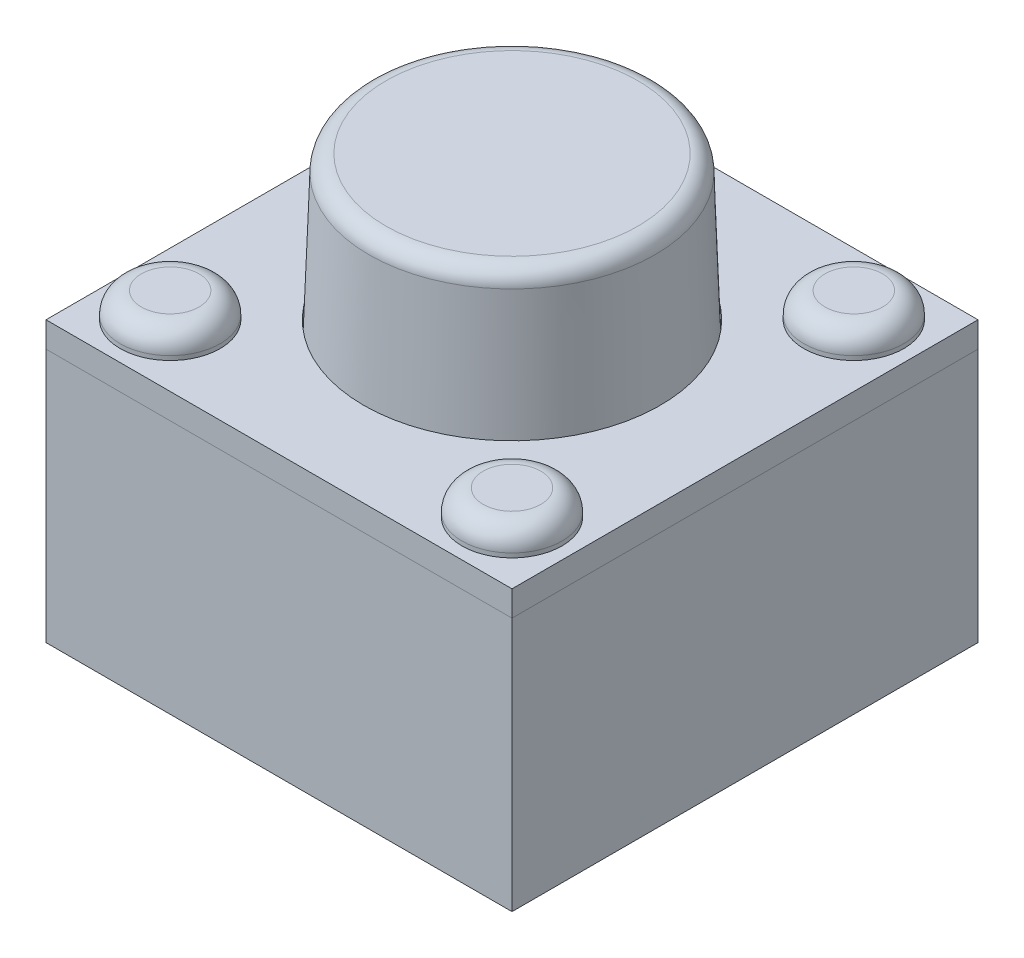
ISO-10303-21;
HEADER;
FILE_DESCRIPTION(('STEP AP214'),'2;1');
FILE_NAME('part.step','',(''),(''),'','','');
FILE_SCHEMA(('AUTOMOTIVE_DESIGN { 1 0 10303 214 1 1 1 1 }'));
ENDSEC;
DATA;
#1=APPLICATION_CONTEXT('core data for automotive mechanical design processes');
#2=APPLICATION_PROTOCOL_DEFINITION('international standard','automotive_design',2000,#1);
#3=PRODUCT_CONTEXT('',#1,'mechanical');
#4=PRODUCT('Part','Part','',(#3));
#5=PRODUCT_RELATED_PRODUCT_CATEGORY('part','',(#4));
#6=PRODUCT_DEFINITION_FORMATION('','',#4);
#7=PRODUCT_DEFINITION_CONTEXT('part definition',#1,'design');
#8=PRODUCT_DEFINITION('design','',#6,#7);
#9=PRODUCT_DEFINITION_SHAPE('','',#8);
#10=(LENGTH_UNIT() NAMED_UNIT(*) SI_UNIT(.MILLI.,.METRE.));
#11=(NAMED_UNIT(*) PLANE_ANGLE_UNIT() SI_UNIT($,.RADIAN.));
#12=(NAMED_UNIT(*) SI_UNIT($,.STERADIAN.) SOLID_ANGLE_UNIT());
#13=UNCERTAINTY_MEASURE_WITH_UNIT(LENGTH_MEASURE(1.E-05),#10,'distance_accuracy_value','');
#14=(GEOMETRIC_REPRESENTATION_CONTEXT(3) GLOBAL_UNCERTAINTY_ASSIGNED_CONTEXT((#13)) GLOBAL_UNIT_ASSIGNED_CONTEXT((#10,
#11,#12)) REPRESENTATION_CONTEXT('',''));
#15=CARTESIAN_POINT('',(0.,0.,0.));
#16=DIRECTION('',(0.,0.,1.));
#17=DIRECTION('',(1.,0.,0.));
#18=AXIS2_PLACEMENT_3D('',#15,#16,#17);
#19=CARTESIAN_POINT('',(0.,3.,0.));
#20=DIRECTION('',(0.,-1.,0.));
#21=DIRECTION('',(0.,0.,1.));
#22=AXIS2_PLACEMENT_3D('',#19,#20,#21);
#23=CONICAL_SURFACE('',#22,1.75,0.0349065850398867);
#24=CARTESIAN_POINT('',(0.,4.8069798993405,0.));
#25=DIRECTION('',(0.,-1.,0.));
#26=DIRECTION('',(0.,0.,-1.));
#27=AXIS2_PLACEMENT_3D('',#24,#25,#26);
#28=CIRCLE('',#27,1.68689887145891);
#29=CARTESIAN_POINT('',(0.,4.8069798993405,-1.68689887145891));
#30=VERTEX_POINT('',#29);
#31=EDGE_CURVE('E11',#30,#30,#28,.T.);
#32=ORIENTED_EDGE('',*,*,#31,.T.);
#33=EDGE_LOOP('',(#32));
#34=FACE_BOUND('',#33,.T.);
#35=CARTESIAN_POINT('',(0.,3.,0.));
#36=DIRECTION('',(0.,1.,0.));
#37=DIRECTION('',(0.,0.,1.));
#38=AXIS2_PLACEMENT_3D('',#35,#36,#37);
#39=CIRCLE('',#38,1.75);
#40=CARTESIAN_POINT('',(0.,3.,1.75));
#41=VERTEX_POINT('',#40);
#42=EDGE_CURVE('E54',#41,#41,#39,.T.);
#43=ORIENTED_EDGE('',*,*,#42,.T.);
#44=EDGE_LOOP('',(#43));
#45=FACE_BOUND('',#44,.T.);
#46=ADVANCED_FACE('F43',(#34,#45),#23,.T.);
#47=CARTESIAN_POINT('',(0.,5.,0.));
#48=DIRECTION('',(0.,1.,0.));
#49=DIRECTION('',(0.,0.,1.));
#50=AXIS2_PLACEMENT_3D('',#47,#48,#49);
#51=PLANE('',#50);
#52=CARTESIAN_POINT('',(0.,5.,0.));
#53=DIRECTION('',(0.,1.,0.));
#54=DIRECTION('',(0.,0.,1.));
#55=AXIS2_PLACEMENT_3D('',#52,#53,#54);
#56=CIRCLE('',#55,1.48702070605509);
#57=CARTESIAN_POINT('',(0.,5.,1.48702070605509));
#58=VERTEX_POINT('',#57);
#59=EDGE_CURVE('E50',#58,#58,#56,.T.);
#60=ORIENTED_EDGE('',*,*,#59,.T.);
#61=EDGE_LOOP('',(#60));
#62=FACE_BOUND('',#61,.T.);
#63=ADVANCED_FACE('F64',(#62),#51,.T.);
#64=CARTESIAN_POINT('',(0.,3.,0.));
#65=DIRECTION('',(0.,1.,0.));
#66=DIRECTION('',(0.,0.,1.));
#67=AXIS2_PLACEMENT_3D('',#64,#65,#66);
#68=PLANE('',#67);
#69=ORIENTED_EDGE('',*,*,#42,.F.);
#70=EDGE_LOOP('',(#69));
#71=FACE_BOUND('',#70,.T.);
#72=ADVANCED_FACE('F62',(#71),#68,.F.);
#73=CARTESIAN_POINT('',(0.,4.8,0.));
#74=DIRECTION('',(0.,1.,0.));
#75=DIRECTION('',(0.,0.,1.));
#76=AXIS2_PLACEMENT_3D('',#73,#74,#75);
#77=TOROIDAL_SURFACE('',#76,1.48702070605509,0.2);
#78=ORIENTED_EDGE('',*,*,#31,.F.);
#79=EDGE_LOOP('',(#78));
#80=FACE_BOUND('',#79,.T.);
#81=ORIENTED_EDGE('',*,*,#59,.F.);
#82=EDGE_LOOP('',(#81));
#83=FACE_BOUND('',#82,.T.);
#84=ADVANCED_FACE('F45',(#80,#83),#77,.T.);
#85=CLOSED_SHELL('',(#46,#63,#72,#84));
#86=MANIFOLD_SOLID_BREP('B2',#85);
#87=CARTESIAN_POINT('',(0.,3.3,0.));
#88=DIRECTION('',(0.,1.,0.));
#89=DIRECTION('',(0.,0.,1.));
#90=AXIS2_PLACEMENT_3D('',#87,#88,#89);
#91=PLANE('',#90);
#92=CARTESIAN_POINT('',(2.01719027237659,3.3,2.01719027237636));
#93=DIRECTION('',(0.,1.,0.));
#94=DIRECTION('',(0.,0.,1.));
#95=AXIS2_PLACEMENT_3D('',#92,#93,#94);
#96=CIRCLE('',#95,0.59000000000016);
#97=CARTESIAN_POINT('',(2.01719027237659,3.3,2.60719027237652));
#98=VERTEX_POINT('',#97);
#99=EDGE_CURVE('E201',#98,#98,#96,.T.);
#100=ORIENTED_EDGE('',*,*,#99,.F.);
#101=EDGE_LOOP('',(#100));
#102=FACE_BOUND('',#101,.T.);
#103=CARTESIAN_POINT('',(-2.01719027237647,3.3,-2.01719027237647));
#104=DIRECTION('',(0.,1.,0.));
#105=DIRECTION('',(0.,0.,1.));
#106=AXIS2_PLACEMENT_3D('',#103,#104,#105);
#107=CIRCLE('',#106,0.59);
#108=CARTESIAN_POINT('',(-2.01719027237647,3.3,-1.42719027237647));
#109=VERTEX_POINT('',#108);
#110=EDGE_CURVE('E189',#109,#109,#107,.T.);
#111=ORIENTED_EDGE('',*,*,#110,.F.);
#112=EDGE_LOOP('',(#111));
#113=FACE_BOUND('',#112,.T.);
#114=DIRECTION('',(-1.,0.,0.));
#115=VECTOR('',#114,1.);
#116=CARTESIAN_POINT('',(2.75,3.3,-2.75));
#117=LINE('',#116,#115);
#118=CARTESIAN_POINT('',(2.75,3.3,-2.75));
#119=VERTEX_POINT('',#118);
#120=CARTESIAN_POINT('',(-2.75,3.3,-2.75));
#121=VERTEX_POINT('',#120);
#122=EDGE_CURVE('E159',#119,#121,#117,.T.);
#123=ORIENTED_EDGE('',*,*,#122,.T.);
#124=DIRECTION('',(0.,0.,1.));
#125=VECTOR('',#124,1.);
#126=CARTESIAN_POINT('',(-2.75,3.3,-2.75));
#127=LINE('',#126,#125);
#128=CARTESIAN_POINT('',(-2.75,3.3,2.75));
#129=VERTEX_POINT('',#128);
#130=EDGE_CURVE('E154',#121,#129,#127,.T.);
#131=ORIENTED_EDGE('',*,*,#130,.T.);
#132=DIRECTION('',(1.,0.,0.));
#133=VECTOR('',#132,1.);
#134=CARTESIAN_POINT('',(-2.75,3.3,2.75));
#135=LINE('',#134,#133);
#136=CARTESIAN_POINT('',(2.75,3.3,2.75));
#137=VERTEX_POINT('',#136);
#138=EDGE_CURVE('E157',#129,#137,#135,.T.);
#139=ORIENTED_EDGE('',*,*,#138,.T.);
#140=DIRECTION('',(0.,0.,-1.));
#141=VECTOR('',#140,1.);
#142=CARTESIAN_POINT('',(2.75,3.3,2.75));
#143=LINE('',#142,#141);
#144=EDGE_CURVE('E124',#137,#119,#143,.T.);
#145=ORIENTED_EDGE('',*,*,#144,.T.);
#146=EDGE_LOOP('',(#123,#131,#139,#145));
#147=FACE_BOUND('',#146,.T.);
#148=CARTESIAN_POINT('',(0.,3.3,0.));
#149=DIRECTION('',(0.,1.,0.));
#150=DIRECTION('',(0.,0.,1.));
#151=AXIS2_PLACEMENT_3D('',#148,#149,#150);
#152=CIRCLE('',#151,1.75);
#153=CARTESIAN_POINT('',(0.,3.3,1.75));
#154=VERTEX_POINT('',#153);
#155=EDGE_CURVE('E174',#154,#154,#152,.T.);
#156=ORIENTED_EDGE('',*,*,#155,.F.);
#157=EDGE_LOOP('',(#156));
#158=FACE_BOUND('',#157,.T.);
#159=CARTESIAN_POINT('',(2.01719027237647,3.3,-2.01719027237659));
#160=DIRECTION('',(0.,1.,0.));
#161=DIRECTION('',(0.,0.,1.));
#162=AXIS2_PLACEMENT_3D('',#159,#160,#161);
#163=CIRCLE('',#162,0.590000000000117);
#164=CARTESIAN_POINT('',(2.01719027237647,3.3,-1.42719027237647));
#165=VERTEX_POINT('',#164);
#166=EDGE_CURVE('E195',#165,#165,#163,.T.);
#167=ORIENTED_EDGE('',*,*,#166,.F.);
#168=EDGE_LOOP('',(#167));
#169=FACE_BOUND('',#168,.T.);
#170=CARTESIAN_POINT('',(-2.01719027237636,3.3,2.01719027237647));
#171=DIRECTION('',(0.,1.,0.));
#172=DIRECTION('',(0.,0.,1.));
#173=AXIS2_PLACEMENT_3D('',#170,#171,#172);
#174=CIRCLE('',#173,0.590000000000059);
#175=CARTESIAN_POINT('',(-2.01719027237636,3.3,2.60719027237653));
#176=VERTEX_POINT('',#175);
#177=EDGE_CURVE('E207',#176,#176,#174,.T.);
#178=ORIENTED_EDGE('',*,*,#177,.F.);
#179=EDGE_LOOP('',(#178));
#180=FACE_BOUND('',#179,.T.);
#181=ADVANCED_FACE('F107',(#102,#113,#147,#158,#169,#180),#91,.T.);
#182=CARTESIAN_POINT('',(0.,3.,0.));
#183=DIRECTION('',(0.,1.,0.));
#184=DIRECTION('',(0.,0.,1.));
#185=AXIS2_PLACEMENT_3D('',#182,#183,#184);
#186=PLANE('',#185);
#187=CARTESIAN_POINT('',(2.01719027237659,3.,2.01719027237636));
#188=DIRECTION('',(0.,1.,0.));
#189=DIRECTION('',(0.,0.,1.));
#190=AXIS2_PLACEMENT_3D('',#187,#188,#189);
#191=CIRCLE('',#190,0.59000000000016);
#192=CARTESIAN_POINT('',(2.01719027237659,3.,2.60719027237652));
#193=VERTEX_POINT('',#192);
#194=EDGE_CURVE('E204',#193,#193,#191,.T.);
#195=ORIENTED_EDGE('',*,*,#194,.T.);
#196=EDGE_LOOP('',(#195));
#197=FACE_BOUND('',#196,.T.);
#198=CARTESIAN_POINT('',(-2.01719027237647,3.,-2.01719027237647));
#199=DIRECTION('',(0.,1.,0.));
#200=DIRECTION('',(0.,0.,1.));
#201=AXIS2_PLACEMENT_3D('',#198,#199,#200);
#202=CIRCLE('',#201,0.59);
#203=CARTESIAN_POINT('',(-2.01719027237647,3.,-1.42719027237647));
#204=VERTEX_POINT('',#203);
#205=EDGE_CURVE('E192',#204,#204,#202,.T.);
#206=ORIENTED_EDGE('',*,*,#205,.T.);
#207=EDGE_LOOP('',(#206));
#208=FACE_BOUND('',#207,.T.);
#209=DIRECTION('',(-1.,0.,0.));
#210=VECTOR('',#209,1.);
#211=CARTESIAN_POINT('',(2.75,3.,-2.75));
#212=LINE('',#211,#210);
#213=CARTESIAN_POINT('',(2.75,3.,-2.75));
#214=VERTEX_POINT('',#213);
#215=CARTESIAN_POINT('',(-2.75,3.,-2.75));
#216=VERTEX_POINT('',#215);
#217=EDGE_CURVE('E171',#214,#216,#212,.T.);
#218=ORIENTED_EDGE('',*,*,#217,.F.);
#219=DIRECTION('',(0.,0.,-1.));
#220=VECTOR('',#219,1.);
#221=CARTESIAN_POINT('',(2.75,3.,2.75));
#222=LINE('',#221,#220);
#223=CARTESIAN_POINT('',(2.75,3.,2.75));
#224=VERTEX_POINT('',#223);
#225=EDGE_CURVE('E147',#224,#214,#222,.T.);
#226=ORIENTED_EDGE('',*,*,#225,.F.);
#227=DIRECTION('',(1.,0.,0.));
#228=VECTOR('',#227,1.);
#229=CARTESIAN_POINT('',(-2.75,3.,2.75));
#230=LINE('',#229,#228);
#231=CARTESIAN_POINT('',(-2.75,3.,2.75));
#232=VERTEX_POINT('',#231);
#233=EDGE_CURVE('E141',#232,#224,#230,.T.);
#234=ORIENTED_EDGE('',*,*,#233,.F.);
#235=DIRECTION('',(0.,0.,1.));
#236=VECTOR('',#235,1.);
#237=CARTESIAN_POINT('',(-2.75,3.,-2.75));
#238=LINE('',#237,#236);
#239=EDGE_CURVE('E163',#216,#232,#238,.T.);
#240=ORIENTED_EDGE('',*,*,#239,.F.);
#241=EDGE_LOOP('',(#218,#226,#234,#240));
#242=FACE_BOUND('',#241,.T.);
#243=CARTESIAN_POINT('',(0.,3.,0.));
#244=DIRECTION('',(0.,1.,0.));
#245=DIRECTION('',(0.,0.,1.));
#246=AXIS2_PLACEMENT_3D('',#243,#244,#245);
#247=CIRCLE('',#246,1.75);
#248=CARTESIAN_POINT('',(0.,3.,1.75));
#249=VERTEX_POINT('',#248);
#250=EDGE_CURVE('E186',#249,#249,#247,.T.);
#251=ORIENTED_EDGE('',*,*,#250,.T.);
#252=EDGE_LOOP('',(#251));
#253=FACE_BOUND('',#252,.T.);
#254=CARTESIAN_POINT('',(2.01719027237647,3.,-2.01719027237659));
#255=DIRECTION('',(0.,1.,0.));
#256=DIRECTION('',(0.,0.,1.));
#257=AXIS2_PLACEMENT_3D('',#254,#255,#256);
#258=CIRCLE('',#257,0.590000000000117);
#259=CARTESIAN_POINT('',(2.01719027237647,3.,-1.42719027237647));
#260=VERTEX_POINT('',#259);
#261=EDGE_CURVE('E198',#260,#260,#258,.T.);
#262=ORIENTED_EDGE('',*,*,#261,.T.);
#263=EDGE_LOOP('',(#262));
#264=FACE_BOUND('',#263,.T.);
#265=CARTESIAN_POINT('',(-2.01719027237636,3.,2.01719027237647));
#266=DIRECTION('',(0.,1.,0.));
#267=DIRECTION('',(0.,0.,1.));
#268=AXIS2_PLACEMENT_3D('',#265,#266,#267);
#269=CIRCLE('',#268,0.590000000000059);
#270=CARTESIAN_POINT('',(-2.01719027237636,3.,2.60719027237653));
#271=VERTEX_POINT('',#270);
#272=EDGE_CURVE('E210',#271,#271,#269,.T.);
#273=ORIENTED_EDGE('',*,*,#272,.T.);
#274=EDGE_LOOP('',(#273));
#275=FACE_BOUND('',#274,.T.);
#276=ADVANCED_FACE('F182',(#197,#208,#242,#253,#264,#275),#186,.F.);
#277=CARTESIAN_POINT('',(2.75,3.3,-2.75));
#278=DIRECTION('',(0.,0.,1.));
#279=DIRECTION('',(1.,0.,0.));
#280=AXIS2_PLACEMENT_3D('',#277,#278,#279);
#281=PLANE('',#280);
#282=ORIENTED_EDGE('',*,*,#217,.T.);
#283=DIRECTION('',(0.,-1.,0.));
#284=VECTOR('',#283,1.);
#285=CARTESIAN_POINT('',(-2.75,3.3,-2.75));
#286=LINE('',#285,#284);
#287=EDGE_CURVE('E41',#121,#216,#286,.T.);
#288=ORIENTED_EDGE('',*,*,#287,.F.);
#289=ORIENTED_EDGE('',*,*,#122,.F.);
#290=DIRECTION('',(0.,-1.,0.));
#291=VECTOR('',#290,1.);
#292=CARTESIAN_POINT('',(2.75,3.3,-2.75));
#293=LINE('',#292,#291);
#294=EDGE_CURVE('E167',#119,#214,#293,.T.);
#295=ORIENTED_EDGE('',*,*,#294,.T.);
#296=EDGE_LOOP('',(#282,#288,#289,#295));
#297=FACE_BOUND('',#296,.T.);
#298=ADVANCED_FACE('F109',(#297),#281,.F.);
#299=CARTESIAN_POINT('',(-2.75,3.3,-2.75));
#300=DIRECTION('',(1.,0.,0.));
#301=DIRECTION('',(0.,0.,-1.));
#302=AXIS2_PLACEMENT_3D('',#299,#300,#301);
#303=PLANE('',#302);
#304=ORIENTED_EDGE('',*,*,#239,.T.);
#305=DIRECTION('',(0.,-1.,0.));
#306=VECTOR('',#305,1.);
#307=CARTESIAN_POINT('',(-2.75,3.3,2.75));
#308=LINE('',#307,#306);
#309=EDGE_CURVE('E116',#129,#232,#308,.T.);
#310=ORIENTED_EDGE('',*,*,#309,.F.);
#311=ORIENTED_EDGE('',*,*,#130,.F.);
#312=ORIENTED_EDGE('',*,*,#287,.T.);
#313=EDGE_LOOP('',(#304,#310,#311,#312));
#314=FACE_BOUND('',#313,.T.);
#315=ADVANCED_FACE('F162',(#314),#303,.F.);
#316=CARTESIAN_POINT('',(-2.75,3.3,2.75));
#317=DIRECTION('',(0.,0.,-1.));
#318=DIRECTION('',(-1.,0.,0.));
#319=AXIS2_PLACEMENT_3D('',#316,#317,#318);
#320=PLANE('',#319);
#321=ORIENTED_EDGE('',*,*,#233,.T.);
#322=DIRECTION('',(0.,-1.,0.));
#323=VECTOR('',#322,1.);
#324=CARTESIAN_POINT('',(2.75,3.3,2.75));
#325=LINE('',#324,#323);
#326=EDGE_CURVE('E164',#137,#224,#325,.T.);
#327=ORIENTED_EDGE('',*,*,#326,.F.);
#328=ORIENTED_EDGE('',*,*,#138,.F.);
#329=ORIENTED_EDGE('',*,*,#309,.T.);
#330=EDGE_LOOP('',(#321,#327,#328,#329));
#331=FACE_BOUND('',#330,.T.);
#332=ADVANCED_FACE('F165',(#331),#320,.F.);
#333=CARTESIAN_POINT('',(2.75,3.3,2.75));
#334=DIRECTION('',(-1.,0.,0.));
#335=DIRECTION('',(0.,0.,1.));
#336=AXIS2_PLACEMENT_3D('',#333,#334,#335);
#337=PLANE('',#336);
#338=ORIENTED_EDGE('',*,*,#225,.T.);
#339=ORIENTED_EDGE('',*,*,#294,.F.);
#340=ORIENTED_EDGE('',*,*,#144,.F.);
#341=ORIENTED_EDGE('',*,*,#326,.T.);
#342=EDGE_LOOP('',(#338,#339,#340,#341));
#343=FACE_BOUND('',#342,.T.);
#344=ADVANCED_FACE('F179',(#343),#337,.F.);
#345=CARTESIAN_POINT('',(0.,3.3,0.));
#346=DIRECTION('',(0.,-1.,0.));
#347=DIRECTION('',(0.,0.,-1.));
#348=AXIS2_PLACEMENT_3D('',#345,#346,#347);
#349=CYLINDRICAL_SURFACE('',#348,1.75);
#350=ORIENTED_EDGE('',*,*,#155,.T.);
#351=EDGE_LOOP('',(#350));
#352=FACE_BOUND('',#351,.T.);
#353=ORIENTED_EDGE('',*,*,#250,.F.);
#354=EDGE_LOOP('',(#353));
#355=FACE_BOUND('',#354,.T.);
#356=ADVANCED_FACE('F230',(#352,#355),#349,.F.);
#357=CARTESIAN_POINT('',(-2.01719027237647,3.3,-2.01719027237647));
#358=DIRECTION('',(0.,-1.,0.));
#359=DIRECTION('',(0.,0.,-1.));
#360=AXIS2_PLACEMENT_3D('',#357,#358,#359);
#361=CYLINDRICAL_SURFACE('',#360,0.59);
#362=ORIENTED_EDGE('',*,*,#110,.T.);
#363=EDGE_LOOP('',(#362));
#364=FACE_BOUND('',#363,.T.);
#365=ORIENTED_EDGE('',*,*,#205,.F.);
#366=EDGE_LOOP('',(#365));
#367=FACE_BOUND('',#366,.T.);
#368=ADVANCED_FACE('F276',(#364,#367),#361,.F.);
#369=CARTESIAN_POINT('',(2.01719027237647,3.3,-2.01719027237659));
#370=DIRECTION('',(0.,-1.,0.));
#371=DIRECTION('',(0.,0.,-1.));
#372=AXIS2_PLACEMENT_3D('',#369,#370,#371);
#373=CYLINDRICAL_SURFACE('',#372,0.590000000000117);
#374=ORIENTED_EDGE('',*,*,#166,.T.);
#375=EDGE_LOOP('',(#374));
#376=FACE_BOUND('',#375,.T.);
#377=ORIENTED_EDGE('',*,*,#261,.F.);
#378=EDGE_LOOP('',(#377));
#379=FACE_BOUND('',#378,.T.);
#380=ADVANCED_FACE('F284',(#376,#379),#373,.F.);
#381=CARTESIAN_POINT('',(2.01719027237659,3.3,2.01719027237636));
#382=DIRECTION('',(0.,-1.,0.));
#383=DIRECTION('',(0.,0.,-1.));
#384=AXIS2_PLACEMENT_3D('',#381,#382,#383);
#385=CYLINDRICAL_SURFACE('',#384,0.59000000000016);
#386=ORIENTED_EDGE('',*,*,#99,.T.);
#387=EDGE_LOOP('',(#386));
#388=FACE_BOUND('',#387,.T.);
#389=ORIENTED_EDGE('',*,*,#194,.F.);
#390=EDGE_LOOP('',(#389));
#391=FACE_BOUND('',#390,.T.);
#392=ADVANCED_FACE('F292',(#388,#391),#385,.F.);
#393=CARTESIAN_POINT('',(-2.01719027237636,3.3,2.01719027237647));
#394=DIRECTION('',(0.,-1.,0.));
#395=DIRECTION('',(0.,0.,-1.));
#396=AXIS2_PLACEMENT_3D('',#393,#394,#395);
#397=CYLINDRICAL_SURFACE('',#396,0.590000000000059);
#398=ORIENTED_EDGE('',*,*,#177,.T.);
#399=EDGE_LOOP('',(#398));
#400=FACE_BOUND('',#399,.T.);
#401=ORIENTED_EDGE('',*,*,#272,.F.);
#402=EDGE_LOOP('',(#401));
#403=FACE_BOUND('',#402,.T.);
#404=ADVANCED_FACE('F216',(#400,#403),#397,.F.);
#405=CLOSED_SHELL('',(#181,#276,#298,#315,#332,#344,#356,#368,#380,#392,#404));
#406=MANIFOLD_SOLID_BREP('B6',#405);
#407=CARTESIAN_POINT('',(0.,3.,0.));
#408=DIRECTION('',(0.,1.,0.));
#409=DIRECTION('',(0.,0.,1.));
#410=AXIS2_PLACEMENT_3D('',#407,#408,#409);
#411=PLANE('',#410);
#412=CARTESIAN_POINT('',(2.01719027237659,3.,2.01719027237636));
#413=DIRECTION('',(0.,1.,0.));
#414=DIRECTION('',(0.,0.,1.));
#415=AXIS2_PLACEMENT_3D('',#412,#413,#414);
#416=CIRCLE('',#415,0.59000000000016);
#417=CARTESIAN_POINT('',(2.01719027237659,3.,2.60719027237652));
#418=VERTEX_POINT('',#417);
#419=EDGE_CURVE('E518',#418,#418,#416,.T.);
#420=ORIENTED_EDGE('',*,*,#419,.F.);
#421=EDGE_LOOP('',(#420));
#422=FACE_BOUND('',#421,.T.);
#423=CARTESIAN_POINT('',(-2.01719027237647,3.,-2.01719027237647));
#424=DIRECTION('',(0.,1.,0.));
#425=DIRECTION('',(0.,0.,1.));
#426=AXIS2_PLACEMENT_3D('',#423,#424,#425);
#427=CIRCLE('',#426,0.59);
#428=CARTESIAN_POINT('',(-2.01719027237647,3.,-1.42719027237647));
#429=VERTEX_POINT('',#428);
#430=EDGE_CURVE('E406',#429,#429,#427,.T.);
#431=ORIENTED_EDGE('',*,*,#430,.F.);
#432=EDGE_LOOP('',(#431));
#433=FACE_BOUND('',#432,.T.);
#434=DIRECTION('',(0.,0.,-1.));
#435=VECTOR('',#434,1.);
#436=CARTESIAN_POINT('',(2.75,3.,-2.75));
#437=LINE('',#436,#435);
#438=CARTESIAN_POINT('',(2.75,3.,2.75));
#439=VERTEX_POINT('',#438);
#440=CARTESIAN_POINT('',(2.75,3.,-2.75));
#441=VERTEX_POINT('',#440);
#442=EDGE_CURVE('E388',#439,#441,#437,.T.);
#443=ORIENTED_EDGE('',*,*,#442,.T.);
#444=DIRECTION('',(-1.,0.,0.));
#445=VECTOR('',#444,1.);
#446=CARTESIAN_POINT('',(-2.75,3.,-2.75));
#447=LINE('',#446,#445);
#448=CARTESIAN_POINT('',(-2.75,3.,-2.75));
#449=VERTEX_POINT('',#448);
#450=EDGE_CURVE('E383',#441,#449,#447,.T.);
#451=ORIENTED_EDGE('',*,*,#450,.T.);
#452=DIRECTION('',(0.,0.,1.));
#453=VECTOR('',#452,1.);
#454=CARTESIAN_POINT('',(-2.75,3.,-2.75));
#455=LINE('',#454,#453);
#456=CARTESIAN_POINT('',(-2.75,3.,2.75));
#457=VERTEX_POINT('',#456);
#458=EDGE_CURVE('E386',#449,#457,#455,.T.);
#459=ORIENTED_EDGE('',*,*,#458,.T.);
#460=DIRECTION('',(1.,0.,0.));
#461=VECTOR('',#460,1.);
#462=CARTESIAN_POINT('',(-2.75,3.,2.75));
#463=LINE('',#462,#461);
#464=EDGE_CURVE('E352',#457,#439,#463,.T.);
#465=ORIENTED_EDGE('',*,*,#464,.T.);
#466=EDGE_LOOP('',(#443,#451,#459,#465));
#467=FACE_BOUND('',#466,.T.);
#468=CARTESIAN_POINT('',(2.01719027237647,3.,-2.01719027237659));
#469=DIRECTION('',(0.,1.,0.));
#470=DIRECTION('',(0.,0.,1.));
#471=AXIS2_PLACEMENT_3D('',#468,#469,#470);
#472=CIRCLE('',#471,0.590000000000117);
#473=CARTESIAN_POINT('',(2.01719027237647,3.,-1.42719027237647));
#474=VERTEX_POINT('',#473);
#475=EDGE_CURVE('E515',#474,#474,#472,.T.);
#476=ORIENTED_EDGE('',*,*,#475,.F.);
#477=EDGE_LOOP('',(#476));
#478=FACE_BOUND('',#477,.T.);
#479=CARTESIAN_POINT('',(-2.01719027237636,3.,2.01719027237647));
#480=DIRECTION('',(0.,1.,0.));
#481=DIRECTION('',(0.,0.,1.));
#482=AXIS2_PLACEMENT_3D('',#479,#480,#481);
#483=CIRCLE('',#482,0.590000000000059);
#484=CARTESIAN_POINT('',(-2.01719027237636,3.,2.60719027237653));
#485=VERTEX_POINT('',#484);
#486=EDGE_CURVE('E523',#485,#485,#483,.T.);
#487=ORIENTED_EDGE('',*,*,#486,.F.);
#488=EDGE_LOOP('',(#487));
#489=FACE_BOUND('',#488,.T.);
#490=ADVANCED_FACE('F335',(#422,#433,#467,#478,#489),#411,.T.);
#491=CARTESIAN_POINT('',(2.75,3.,-2.75));
#492=DIRECTION('',(-1.,0.,0.));
#493=DIRECTION('',(0.,0.,1.));
#494=AXIS2_PLACEMENT_3D('',#491,#492,#493);
#495=PLANE('',#494);
#496=DIRECTION('',(0.,0.,-1.));
#497=VECTOR('',#496,1.);
#498=CARTESIAN_POINT('',(2.75,0.,-2.75));
#499=LINE('',#498,#497);
#500=CARTESIAN_POINT('',(2.75,0.,2.75));
#501=VERTEX_POINT('',#500);
#502=CARTESIAN_POINT('',(2.75,0.,-2.75));
#503=VERTEX_POINT('',#502);
#504=EDGE_CURVE('E403',#501,#503,#499,.T.);
#505=ORIENTED_EDGE('',*,*,#504,.T.);
#506=DIRECTION('',(0.,-1.,0.));
#507=VECTOR('',#506,1.);
#508=CARTESIAN_POINT('',(2.75,3.,-2.75));
#509=LINE('',#508,#507);
#510=EDGE_CURVE('E394',#441,#503,#509,.T.);
#511=ORIENTED_EDGE('',*,*,#510,.F.);
#512=ORIENTED_EDGE('',*,*,#442,.F.);
#513=DIRECTION('',(0.,-1.,0.));
#514=VECTOR('',#513,1.);
#515=CARTESIAN_POINT('',(2.75,3.,2.75));
#516=LINE('',#515,#514);
#517=EDGE_CURVE('E399',#439,#501,#516,.T.);
#518=ORIENTED_EDGE('',*,*,#517,.T.);
#519=EDGE_LOOP('',(#505,#511,#512,#518));
#520=FACE_BOUND('',#519,.T.);
#521=ADVANCED_FACE('F445',(#520),#495,.F.);
#522=CARTESIAN_POINT('',(-2.75,3.,-2.75));
#523=DIRECTION('',(0.,0.,1.));
#524=DIRECTION('',(1.,0.,0.));
#525=AXIS2_PLACEMENT_3D('',#522,#523,#524);
#526=PLANE('',#525);
#527=DIRECTION('',(-1.,0.,0.));
#528=VECTOR('',#527,1.);
#529=CARTESIAN_POINT('',(-2.75,0.,-2.75));
#530=LINE('',#529,#528);
#531=CARTESIAN_POINT('',(-2.75,0.,-2.75));
#532=VERTEX_POINT('',#531);
#533=EDGE_CURVE('E393',#503,#532,#530,.T.);
#534=ORIENTED_EDGE('',*,*,#533,.T.);
#535=DIRECTION('',(0.,-1.,0.));
#536=VECTOR('',#535,1.);
#537=CARTESIAN_POINT('',(-2.75,3.,-2.75));
#538=LINE('',#537,#536);
#539=EDGE_CURVE('E391',#449,#532,#538,.T.);
#540=ORIENTED_EDGE('',*,*,#539,.F.);
#541=ORIENTED_EDGE('',*,*,#450,.F.);
#542=ORIENTED_EDGE('',*,*,#510,.T.);
#543=EDGE_LOOP('',(#534,#540,#541,#542));
#544=FACE_BOUND('',#543,.T.);
#545=ADVANCED_FACE('F392',(#544),#526,.F.);
#546=CARTESIAN_POINT('',(-2.75,3.,-2.75));
#547=DIRECTION('',(1.,0.,0.));
#548=DIRECTION('',(0.,0.,-1.));
#549=AXIS2_PLACEMENT_3D('',#546,#547,#548);
#550=PLANE('',#549);
#551=DIRECTION('',(0.,0.,1.));
#552=VECTOR('',#551,1.);
#553=CARTESIAN_POINT('',(-2.75,0.,-2.75));
#554=LINE('',#553,#552);
#555=CARTESIAN_POINT('',(-2.75,0.,2.75));
#556=VERTEX_POINT('',#555);
#557=EDGE_CURVE('E369',#532,#556,#554,.T.);
#558=ORIENTED_EDGE('',*,*,#557,.T.);
#559=DIRECTION('',(0.,-1.,0.));
#560=VECTOR('',#559,1.);
#561=CARTESIAN_POINT('',(-2.75,3.,2.75));
#562=LINE('',#561,#560);
#563=EDGE_CURVE('E395',#457,#556,#562,.T.);
#564=ORIENTED_EDGE('',*,*,#563,.F.);
#565=ORIENTED_EDGE('',*,*,#458,.F.);
#566=ORIENTED_EDGE('',*,*,#539,.T.);
#567=EDGE_LOOP('',(#558,#564,#565,#566));
#568=FACE_BOUND('',#567,.T.);
#569=ADVANCED_FACE('F397',(#568),#550,.F.);
#570=CARTESIAN_POINT('',(-2.75,3.,2.75));
#571=DIRECTION('',(0.,0.,-1.));
#572=DIRECTION('',(-1.,0.,0.));
#573=AXIS2_PLACEMENT_3D('',#570,#571,#572);
#574=PLANE('',#573);
#575=DIRECTION('',(1.,0.,0.));
#576=VECTOR('',#575,1.);
#577=CARTESIAN_POINT('',(-2.75,0.,2.75));
#578=LINE('',#577,#576);
#579=EDGE_CURVE('E375',#556,#501,#578,.T.);
#580=ORIENTED_EDGE('',*,*,#579,.T.);
#581=ORIENTED_EDGE('',*,*,#517,.F.);
#582=ORIENTED_EDGE('',*,*,#464,.F.);
#583=ORIENTED_EDGE('',*,*,#563,.T.);
#584=EDGE_LOOP('',(#580,#581,#582,#583));
#585=FACE_BOUND('',#584,.T.);
#586=ADVANCED_FACE('F462',(#585),#574,.F.);
#587=CARTESIAN_POINT('',(0.,0.,0.));
#588=DIRECTION('',(0.,1.,0.));
#589=DIRECTION('',(0.,0.,1.));
#590=AXIS2_PLACEMENT_3D('',#587,#588,#589);
#591=PLANE('',#590);
#592=ORIENTED_EDGE('',*,*,#504,.F.);
#593=ORIENTED_EDGE('',*,*,#579,.F.);
#594=ORIENTED_EDGE('',*,*,#557,.F.);
#595=ORIENTED_EDGE('',*,*,#533,.F.);
#596=EDGE_LOOP('',(#592,#593,#594,#595));
#597=FACE_BOUND('',#596,.T.);
#598=ADVANCED_FACE('F459',(#597),#591,.F.);
#599=CARTESIAN_POINT('',(-2.01719027237647,3.6,-2.01719027237647));
#600=DIRECTION('',(0.,-1.,0.));
#601=DIRECTION('',(0.,0.,-1.));
#602=AXIS2_PLACEMENT_3D('',#599,#600,#601);
#603=CYLINDRICAL_SURFACE('',#602,0.59);
#604=CARTESIAN_POINT('',(-2.01719027237647,3.35,-2.01719027237647));
#605=DIRECTION('',(0.,1.,0.));
#606=DIRECTION('',(0.,0.,1.));
#607=AXIS2_PLACEMENT_3D('',#604,#605,#606);
#608=CIRCLE('',#607,0.59);
#609=CARTESIAN_POINT('',(-2.01719027237647,3.35,-1.42719027237647));
#610=VERTEX_POINT('',#609);
#611=EDGE_CURVE('E105',#610,#610,#608,.F.);
#612=ORIENTED_EDGE('',*,*,#611,.T.);
#613=EDGE_LOOP('',(#612));
#614=FACE_BOUND('',#613,.T.);
#615=ORIENTED_EDGE('',*,*,#430,.T.);
#616=EDGE_LOOP('',(#615));
#617=FACE_BOUND('',#616,.T.);
#618=ADVANCED_FACE('F457',(#614,#617),#603,.T.);
#619=CARTESIAN_POINT('',(0.,3.6,0.));
#620=DIRECTION('',(0.,1.,0.));
#621=DIRECTION('',(0.,0.,1.));
#622=AXIS2_PLACEMENT_3D('',#619,#620,#621);
#623=PLANE('',#622);
#624=CARTESIAN_POINT('',(-2.01719027237647,3.6,-2.01719027237647));
#625=DIRECTION('',(0.,1.,0.));
#626=DIRECTION('',(0.,0.,1.));
#627=AXIS2_PLACEMENT_3D('',#624,#625,#626);
#628=CIRCLE('',#627,0.34);
#629=CARTESIAN_POINT('',(-2.01719027237647,3.6,-1.67719027237647));
#630=VERTEX_POINT('',#629);
#631=EDGE_CURVE('E344',#630,#630,#628,.T.);
#632=ORIENTED_EDGE('',*,*,#631,.T.);
#633=EDGE_LOOP('',(#632));
#634=FACE_BOUND('',#633,.T.);
#635=ADVANCED_FACE('F433',(#634),#623,.T.);
#636=CARTESIAN_POINT('',(2.01719027237647,3.6,-2.01719027237659));
#637=DIRECTION('',(0.,-1.,0.));
#638=DIRECTION('',(0.,0.,-1.));
#639=AXIS2_PLACEMENT_3D('',#636,#637,#638);
#640=CYLINDRICAL_SURFACE('',#639,0.590000000000117);
#641=CARTESIAN_POINT('',(2.01719027237647,3.35,-2.01719027237659));
#642=DIRECTION('',(0.,1.,0.));
#643=DIRECTION('',(0.,0.,1.));
#644=AXIS2_PLACEMENT_3D('',#641,#642,#643);
#645=CIRCLE('',#644,0.590000000000117);
#646=CARTESIAN_POINT('',(2.01719027237647,3.35,-1.42719027237647));
#647=VERTEX_POINT('',#646);
#648=EDGE_CURVE('E416',#647,#647,#645,.F.);
#649=ORIENTED_EDGE('',*,*,#648,.T.);
#650=EDGE_LOOP('',(#649));
#651=FACE_BOUND('',#650,.T.);
#652=ORIENTED_EDGE('',*,*,#475,.T.);
#653=EDGE_LOOP('',(#652));
#654=FACE_BOUND('',#653,.T.);
#655=ADVANCED_FACE('F501',(#651,#654),#640,.T.);
#656=CARTESIAN_POINT('',(0.,3.6,0.));
#657=DIRECTION('',(0.,1.,0.));
#658=DIRECTION('',(0.,0.,1.));
#659=AXIS2_PLACEMENT_3D('',#656,#657,#658);
#660=PLANE('',#659);
#661=CARTESIAN_POINT('',(2.01719027237647,3.6,-2.01719027237659));
#662=DIRECTION('',(0.,1.,0.));
#663=DIRECTION('',(0.,0.,1.));
#664=AXIS2_PLACEMENT_3D('',#661,#662,#663);
#665=CIRCLE('',#664,0.340000000000117);
#666=CARTESIAN_POINT('',(2.01719027237647,3.6,-1.67719027237647));
#667=VERTEX_POINT('',#666);
#668=EDGE_CURVE('E413',#667,#667,#665,.T.);
#669=ORIENTED_EDGE('',*,*,#668,.T.);
#670=EDGE_LOOP('',(#669));
#671=FACE_BOUND('',#670,.T.);
#672=ADVANCED_FACE('F494',(#671),#660,.T.);
#673=CARTESIAN_POINT('',(2.01719027237659,3.6,2.01719027237636));
#674=DIRECTION('',(0.,-1.,0.));
#675=DIRECTION('',(0.,0.,-1.));
#676=AXIS2_PLACEMENT_3D('',#673,#674,#675);
#677=CYLINDRICAL_SURFACE('',#676,0.59000000000016);
#678=CARTESIAN_POINT('',(2.01719027237659,3.35,2.01719027237636));
#679=DIRECTION('',(0.,1.,0.));
#680=DIRECTION('',(0.,0.,1.));
#681=AXIS2_PLACEMENT_3D('',#678,#679,#680);
#682=CIRCLE('',#681,0.59000000000016);
#683=CARTESIAN_POINT('',(2.01719027237659,3.35,2.60719027237652));
#684=VERTEX_POINT('',#683);
#685=EDGE_CURVE('E422',#684,#684,#682,.F.);
#686=ORIENTED_EDGE('',*,*,#685,.T.);
#687=EDGE_LOOP('',(#686));
#688=FACE_BOUND('',#687,.T.);
#689=ORIENTED_EDGE('',*,*,#419,.T.);
#690=EDGE_LOOP('',(#689));
#691=FACE_BOUND('',#690,.T.);
#692=ADVANCED_FACE('F486',(#688,#691),#677,.T.);
#693=CARTESIAN_POINT('',(0.,3.6,0.));
#694=DIRECTION('',(0.,1.,0.));
#695=DIRECTION('',(0.,0.,1.));
#696=AXIS2_PLACEMENT_3D('',#693,#694,#695);
#697=PLANE('',#696);
#698=CARTESIAN_POINT('',(2.01719027237659,3.6,2.01719027237636));
#699=DIRECTION('',(0.,1.,0.));
#700=DIRECTION('',(0.,0.,1.));
#701=AXIS2_PLACEMENT_3D('',#698,#699,#700);
#702=CIRCLE('',#701,0.34000000000016);
#703=CARTESIAN_POINT('',(2.01719027237659,3.6,2.35719027237652));
#704=VERTEX_POINT('',#703);
#705=EDGE_CURVE('E419',#704,#704,#702,.T.);
#706=ORIENTED_EDGE('',*,*,#705,.T.);
#707=EDGE_LOOP('',(#706));
#708=FACE_BOUND('',#707,.T.);
#709=ADVANCED_FACE('F483',(#708),#697,.T.);
#710=CARTESIAN_POINT('',(-2.01719027237636,3.6,2.01719027237647));
#711=DIRECTION('',(0.,-1.,0.));
#712=DIRECTION('',(0.,0.,-1.));
#713=AXIS2_PLACEMENT_3D('',#710,#711,#712);
#714=CYLINDRICAL_SURFACE('',#713,0.590000000000059);
#715=CARTESIAN_POINT('',(-2.01719027237636,3.35,2.01719027237647));
#716=DIRECTION('',(0.,1.,0.));
#717=DIRECTION('',(0.,0.,1.));
#718=AXIS2_PLACEMENT_3D('',#715,#716,#717);
#719=CIRCLE('',#718,0.590000000000059);
#720=CARTESIAN_POINT('',(-2.01719027237636,3.35,2.60719027237653));
#721=VERTEX_POINT('',#720);
#722=EDGE_CURVE('E428',#721,#721,#719,.F.);
#723=ORIENTED_EDGE('',*,*,#722,.T.);
#724=EDGE_LOOP('',(#723));
#725=FACE_BOUND('',#724,.T.);
#726=ORIENTED_EDGE('',*,*,#486,.T.);
#727=EDGE_LOOP('',(#726));
#728=FACE_BOUND('',#727,.T.);
#729=ADVANCED_FACE('F485',(#725,#728),#714,.T.);
#730=CARTESIAN_POINT('',(0.,3.6,0.));
#731=DIRECTION('',(0.,1.,0.));
#732=DIRECTION('',(0.,0.,1.));
#733=AXIS2_PLACEMENT_3D('',#730,#731,#732);
#734=PLANE('',#733);
#735=CARTESIAN_POINT('',(-2.01719027237636,3.6,2.01719027237647));
#736=DIRECTION('',(0.,1.,0.));
#737=DIRECTION('',(0.,0.,1.));
#738=AXIS2_PLACEMENT_3D('',#735,#736,#737);
#739=CIRCLE('',#738,0.340000000000059);
#740=CARTESIAN_POINT('',(-2.01719027237636,3.6,2.35719027237653));
#741=VERTEX_POINT('',#740);
#742=EDGE_CURVE('E425',#741,#741,#739,.T.);
#743=ORIENTED_EDGE('',*,*,#742,.T.);
#744=EDGE_LOOP('',(#743));
#745=FACE_BOUND('',#744,.T.);
#746=ADVANCED_FACE('F473',(#745),#734,.T.);
#747=CARTESIAN_POINT('',(2.01719027237647,3.35,-2.01719027237659));
#748=DIRECTION('',(0.,1.,0.));
#749=DIRECTION('',(0.,0.,1.));
#750=AXIS2_PLACEMENT_3D('',#747,#748,#749);
#751=TOROIDAL_SURFACE('',#750,0.340000000000117,0.25);
#752=ORIENTED_EDGE('',*,*,#648,.F.);
#753=EDGE_LOOP('',(#752));
#754=FACE_BOUND('',#753,.T.);
#755=ORIENTED_EDGE('',*,*,#668,.F.);
#756=EDGE_LOOP('',(#755));
#757=FACE_BOUND('',#756,.T.);
#758=ADVANCED_FACE('F470',(#754,#757),#751,.T.);
#759=CARTESIAN_POINT('',(2.01719027237659,3.35,2.01719027237636));
#760=DIRECTION('',(0.,1.,0.));
#761=DIRECTION('',(0.,0.,1.));
#762=AXIS2_PLACEMENT_3D('',#759,#760,#761);
#763=TOROIDAL_SURFACE('',#762,0.34000000000016,0.25);
#764=ORIENTED_EDGE('',*,*,#685,.F.);
#765=EDGE_LOOP('',(#764));
#766=FACE_BOUND('',#765,.T.);
#767=ORIENTED_EDGE('',*,*,#705,.F.);
#768=EDGE_LOOP('',(#767));
#769=FACE_BOUND('',#768,.T.);
#770=ADVANCED_FACE('F441',(#766,#769),#763,.T.);
#771=CARTESIAN_POINT('',(-2.01719027237636,3.35,2.01719027237647));
#772=DIRECTION('',(0.,1.,0.));
#773=DIRECTION('',(0.,0.,1.));
#774=AXIS2_PLACEMENT_3D('',#771,#772,#773);
#775=TOROIDAL_SURFACE('',#774,0.340000000000059,0.25);
#776=ORIENTED_EDGE('',*,*,#722,.F.);
#777=EDGE_LOOP('',(#776));
#778=FACE_BOUND('',#777,.T.);
#779=ORIENTED_EDGE('',*,*,#742,.F.);
#780=EDGE_LOOP('',(#779));
#781=FACE_BOUND('',#780,.T.);
#782=ADVANCED_FACE('F436',(#778,#781),#775,.T.);
#783=CARTESIAN_POINT('',(-2.01719027237647,3.35,-2.01719027237647));
#784=DIRECTION('',(0.,1.,0.));
#785=DIRECTION('',(0.,0.,1.));
#786=AXIS2_PLACEMENT_3D('',#783,#784,#785);
#787=TOROIDAL_SURFACE('',#786,0.34,0.25);
#788=ORIENTED_EDGE('',*,*,#611,.F.);
#789=EDGE_LOOP('',(#788));
#790=FACE_BOUND('',#789,.T.);
#791=ORIENTED_EDGE('',*,*,#631,.F.);
#792=EDGE_LOOP('',(#791));
#793=FACE_BOUND('',#792,.T.);
#794=ADVANCED_FACE('F337',(#790,#793),#787,.T.);
#795=CLOSED_SHELL('',(#490,#521,#545,#569,#586,#598,#618,#635,#655,#672,#692,#709,#729,#746,
#758,#770,#782,#794));
#796=MANIFOLD_SOLID_BREP('B35',#795);
#797=ADVANCED_BREP_SHAPE_REPRESENTATION('',(#18,#86,#406,#796),#14);
#798=SHAPE_DEFINITION_REPRESENTATION(#9,#797);
ENDSEC;
END-ISO-10303-21;
